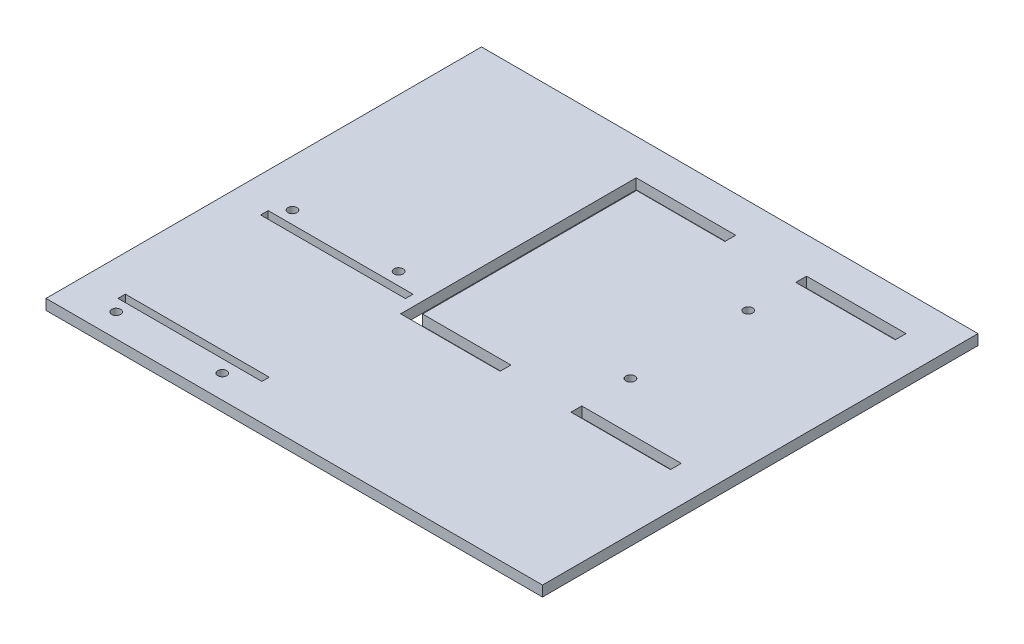
ISO-10303-21;
HEADER;
FILE_DESCRIPTION(('STEP AP214'),'2;1');
FILE_NAME('part.step','',(''),(''),'','','');
FILE_SCHEMA(('AUTOMOTIVE_DESIGN { 1 0 10303 214 1 1 1 1 }'));
ENDSEC;
DATA;
#1=APPLICATION_CONTEXT('core data for automotive mechanical design processes');
#2=APPLICATION_PROTOCOL_DEFINITION('international standard','automotive_design',2000,#1);
#3=PRODUCT_CONTEXT('',#1,'mechanical');
#4=PRODUCT('Part','Part','',(#3));
#5=PRODUCT_RELATED_PRODUCT_CATEGORY('part','',(#4));
#6=PRODUCT_DEFINITION_FORMATION('','',#4);
#7=PRODUCT_DEFINITION_CONTEXT('part definition',#1,'design');
#8=PRODUCT_DEFINITION('design','',#6,#7);
#9=PRODUCT_DEFINITION_SHAPE('','',#8);
#10=(LENGTH_UNIT() NAMED_UNIT(*) SI_UNIT(.MILLI.,.METRE.));
#11=(NAMED_UNIT(*) PLANE_ANGLE_UNIT() SI_UNIT($,.RADIAN.));
#12=(NAMED_UNIT(*) SI_UNIT($,.STERADIAN.) SOLID_ANGLE_UNIT());
#13=UNCERTAINTY_MEASURE_WITH_UNIT(LENGTH_MEASURE(1.E-05),#10,'distance_accuracy_value','');
#14=(GEOMETRIC_REPRESENTATION_CONTEXT(3) GLOBAL_UNCERTAINTY_ASSIGNED_CONTEXT((#13)) GLOBAL_UNIT_ASSIGNED_CONTEXT((#10,
#11,#12)) REPRESENTATION_CONTEXT('',''));
#15=CARTESIAN_POINT('',(0.,0.,0.));
#16=DIRECTION('',(0.,0.,1.));
#17=DIRECTION('',(1.,0.,0.));
#18=AXIS2_PLACEMENT_3D('',#15,#16,#17);
#19=CARTESIAN_POINT('',(0.,186.463763673541,143.058377348707));
#20=DIRECTION('',(0.,0.,-1.));
#21=DIRECTION('',(-1.,0.,0.));
#22=AXIS2_PLACEMENT_3D('',#19,#20,#21);
#23=PLANE('',#22);
#24=DIRECTION('',(0.,-1.,0.));
#25=VECTOR('',#24,1.);
#26=CARTESIAN_POINT('',(-40.25,186.463763673541,143.058377348707));
#27=LINE('',#26,#25);
#28=CARTESIAN_POINT('',(-40.25,2.90000000000001,143.058377348707));
#29=VERTEX_POINT('',#28);
#30=CARTESIAN_POINT('',(-40.25,0.,143.058377348707));
#31=VERTEX_POINT('',#30);
#32=EDGE_CURVE('E303',#29,#31,#27,.T.);
#33=ORIENTED_EDGE('',*,*,#32,.F.);
#34=DIRECTION('',(1.,0.,0.));
#35=VECTOR('',#34,1.);
#36=CARTESIAN_POINT('',(0.,2.90000000000001,143.058377348707));
#37=LINE('',#36,#35);
#38=CARTESIAN_POINT('',(0.,2.90000000000001,143.058377348707));
#39=VERTEX_POINT('',#38);
#40=EDGE_CURVE('E539',#29,#39,#37,.T.);
#41=ORIENTED_EDGE('',*,*,#40,.T.);
#42=DIRECTION('',(0.,-1.,0.));
#43=VECTOR('',#42,1.);
#44=CARTESIAN_POINT('',(0.,186.463763673541,143.058377348707));
#45=LINE('',#44,#43);
#46=CARTESIAN_POINT('',(0.,0.,143.058377348707));
#47=VERTEX_POINT('',#46);
#48=EDGE_CURVE('E301',#39,#47,#45,.T.);
#49=ORIENTED_EDGE('',*,*,#48,.T.);
#50=DIRECTION('',(1.,0.,0.));
#51=VECTOR('',#50,1.);
#52=CARTESIAN_POINT('',(0.,0.,143.058377348707));
#53=LINE('',#52,#51);
#54=EDGE_CURVE('E298',#31,#47,#53,.T.);
#55=ORIENTED_EDGE('',*,*,#54,.F.);
#56=EDGE_LOOP('',(#33,#41,#49,#55));
#57=FACE_BOUND('',#56,.T.);
#58=ADVANCED_FACE('F36',(#57),#23,.T.);
#59=CARTESIAN_POINT('',(-40.25,186.463763673541,140.958377348707));
#60=DIRECTION('',(1.,0.,0.));
#61=DIRECTION('',(0.,0.,-1.));
#62=AXIS2_PLACEMENT_3D('',#59,#60,#61);
#63=PLANE('',#62);
#64=DIRECTION('',(0.,-1.,0.));
#65=VECTOR('',#64,1.);
#66=CARTESIAN_POINT('',(-40.25,186.463763673541,140.958377348707));
#67=LINE('',#66,#65);
#68=CARTESIAN_POINT('',(-40.25,2.90000000000001,140.958377348707));
#69=VERTEX_POINT('',#68);
#70=CARTESIAN_POINT('',(-40.25,0.,140.958377348707));
#71=VERTEX_POINT('',#70);
#72=EDGE_CURVE('E305',#69,#71,#67,.T.);
#73=ORIENTED_EDGE('',*,*,#72,.F.);
#74=DIRECTION('',(0.,0.,1.));
#75=VECTOR('',#74,1.);
#76=CARTESIAN_POINT('',(-40.25,2.90000000000001,140.958377348707));
#77=LINE('',#76,#75);
#78=EDGE_CURVE('E542',#69,#29,#77,.T.);
#79=ORIENTED_EDGE('',*,*,#78,.T.);
#80=ORIENTED_EDGE('',*,*,#32,.T.);
#81=DIRECTION('',(0.,0.,1.));
#82=VECTOR('',#81,1.);
#83=CARTESIAN_POINT('',(-40.25,0.,140.958377348707));
#84=LINE('',#83,#82);
#85=EDGE_CURVE('E295',#71,#31,#84,.T.);
#86=ORIENTED_EDGE('',*,*,#85,.F.);
#87=EDGE_LOOP('',(#73,#79,#80,#86));
#88=FACE_BOUND('',#87,.T.);
#89=ADVANCED_FACE('F458',(#88),#63,.T.);
#90=CARTESIAN_POINT('',(0.,186.463763673541,140.958377348707));
#91=DIRECTION('',(0.,0.,1.));
#92=DIRECTION('',(1.,0.,0.));
#93=AXIS2_PLACEMENT_3D('',#90,#91,#92);
#94=PLANE('',#93);
#95=DIRECTION('',(0.,-1.,0.));
#96=VECTOR('',#95,1.);
#97=CARTESIAN_POINT('',(0.,186.463763673541,140.958377348707));
#98=LINE('',#97,#96);
#99=CARTESIAN_POINT('',(0.,2.90000000000001,140.958377348707));
#100=VERTEX_POINT('',#99);
#101=CARTESIAN_POINT('',(0.,0.,140.958377348707));
#102=VERTEX_POINT('',#101);
#103=EDGE_CURVE('E307',#100,#102,#98,.T.);
#104=ORIENTED_EDGE('',*,*,#103,.F.);
#105=DIRECTION('',(-1.,0.,0.));
#106=VECTOR('',#105,1.);
#107=CARTESIAN_POINT('',(0.,2.90000000000001,140.958377348707));
#108=LINE('',#107,#106);
#109=EDGE_CURVE('E548',#100,#69,#108,.T.);
#110=ORIENTED_EDGE('',*,*,#109,.T.);
#111=ORIENTED_EDGE('',*,*,#72,.T.);
#112=DIRECTION('',(-1.,0.,0.));
#113=VECTOR('',#112,1.);
#114=CARTESIAN_POINT('',(0.,0.,140.958377348707));
#115=LINE('',#114,#113);
#116=EDGE_CURVE('E291',#102,#71,#115,.T.);
#117=ORIENTED_EDGE('',*,*,#116,.F.);
#118=EDGE_LOOP('',(#104,#110,#111,#117));
#119=FACE_BOUND('',#118,.T.);
#120=ADVANCED_FACE('F464',(#119),#94,.T.);
#121=CARTESIAN_POINT('',(0.,186.463763673541,140.958377348707));
#122=DIRECTION('',(-1.,0.,0.));
#123=DIRECTION('',(0.,0.,1.));
#124=AXIS2_PLACEMENT_3D('',#121,#122,#123);
#125=PLANE('',#124);
#126=ORIENTED_EDGE('',*,*,#48,.F.);
#127=DIRECTION('',(0.,0.,-1.));
#128=VECTOR('',#127,1.);
#129=CARTESIAN_POINT('',(0.,2.90000000000001,140.958377348707));
#130=LINE('',#129,#128);
#131=EDGE_CURVE('E551',#39,#100,#130,.T.);
#132=ORIENTED_EDGE('',*,*,#131,.T.);
#133=ORIENTED_EDGE('',*,*,#103,.T.);
#134=DIRECTION('',(0.,0.,-1.));
#135=VECTOR('',#134,1.);
#136=CARTESIAN_POINT('',(0.,0.,140.958377348707));
#137=LINE('',#136,#135);
#138=EDGE_CURVE('E288',#47,#102,#137,.T.);
#139=ORIENTED_EDGE('',*,*,#138,.F.);
#140=EDGE_LOOP('',(#126,#132,#133,#139));
#141=FACE_BOUND('',#140,.T.);
#142=ADVANCED_FACE('F474',(#141),#125,.T.);
#143=CARTESIAN_POINT('',(77.9999999999991,186.463763673541,147.390770958943));
#144=DIRECTION('',(0.,0.,-1.));
#145=DIRECTION('',(-1.,0.,0.));
#146=AXIS2_PLACEMENT_3D('',#143,#144,#145);
#147=PLANE('',#146);
#148=DIRECTION('',(0.,-1.,0.));
#149=VECTOR('',#148,1.);
#150=CARTESIAN_POINT('',(50.3499999999991,186.463763673541,147.390770958943));
#151=LINE('',#150,#149);
#152=CARTESIAN_POINT('',(50.3499999999991,2.90000000000001,147.390770958943));
#153=VERTEX_POINT('',#152);
#154=CARTESIAN_POINT('',(50.3499999999991,0.,147.390770958943));
#155=VERTEX_POINT('',#154);
#156=EDGE_CURVE('E321',#153,#155,#151,.T.);
#157=ORIENTED_EDGE('',*,*,#156,.F.);
#158=DIRECTION('',(1.,0.,0.));
#159=VECTOR('',#158,1.);
#160=CARTESIAN_POINT('',(77.9999999999991,2.90000000000001,147.390770958943));
#161=LINE('',#160,#159);
#162=CARTESIAN_POINT('',(77.9999999999991,2.90000000000001,147.390770958943));
#163=VERTEX_POINT('',#162);
#164=EDGE_CURVE('E403',#153,#163,#161,.T.);
#165=ORIENTED_EDGE('',*,*,#164,.T.);
#166=DIRECTION('',(0.,-1.,0.));
#167=VECTOR('',#166,1.);
#168=CARTESIAN_POINT('',(77.9999999999991,186.463763673541,147.390770958943));
#169=LINE('',#168,#167);
#170=CARTESIAN_POINT('',(77.9999999999991,0.,147.390770958943));
#171=VERTEX_POINT('',#170);
#172=EDGE_CURVE('E319',#163,#171,#169,.T.);
#173=ORIENTED_EDGE('',*,*,#172,.T.);
#174=DIRECTION('',(1.,0.,0.));
#175=VECTOR('',#174,1.);
#176=CARTESIAN_POINT('',(77.9999999999991,0.,147.390770958943));
#177=LINE('',#176,#175);
#178=EDGE_CURVE('E316',#155,#171,#177,.T.);
#179=ORIENTED_EDGE('',*,*,#178,.F.);
#180=EDGE_LOOP('',(#157,#165,#173,#179));
#181=FACE_BOUND('',#180,.T.);
#182=ADVANCED_FACE('F478',(#181),#147,.T.);
#183=CARTESIAN_POINT('',(50.3499999999991,186.463763673541,144.390770958943));
#184=DIRECTION('',(1.,0.,0.));
#185=DIRECTION('',(0.,0.,-1.));
#186=AXIS2_PLACEMENT_3D('',#183,#184,#185);
#187=PLANE('',#186);
#188=DIRECTION('',(0.,-1.,0.));
#189=VECTOR('',#188,1.);
#190=CARTESIAN_POINT('',(50.3499999999991,186.463763673541,144.390770958943));
#191=LINE('',#190,#189);
#192=CARTESIAN_POINT('',(50.3499999999991,2.90000000000001,144.390770958943));
#193=VERTEX_POINT('',#192);
#194=CARTESIAN_POINT('',(50.3499999999991,0.,144.390770958943));
#195=VERTEX_POINT('',#194);
#196=EDGE_CURVE('E324',#193,#195,#191,.T.);
#197=ORIENTED_EDGE('',*,*,#196,.F.);
#198=DIRECTION('',(0.,0.,1.));
#199=VECTOR('',#198,1.);
#200=CARTESIAN_POINT('',(50.3499999999991,2.90000000000001,144.390770958943));
#201=LINE('',#200,#199);
#202=EDGE_CURVE('E400',#193,#153,#201,.T.);
#203=ORIENTED_EDGE('',*,*,#202,.T.);
#204=ORIENTED_EDGE('',*,*,#156,.T.);
#205=DIRECTION('',(0.,0.,1.));
#206=VECTOR('',#205,1.);
#207=CARTESIAN_POINT('',(50.3499999999991,0.,0.));
#208=LINE('',#207,#206);
#209=EDGE_CURVE('E315',#195,#155,#208,.T.);
#210=ORIENTED_EDGE('',*,*,#209,.F.);
#211=EDGE_LOOP('',(#197,#203,#204,#210));
#212=FACE_BOUND('',#211,.T.);
#213=ADVANCED_FACE('F38',(#212),#187,.T.);
#214=CARTESIAN_POINT('',(77.9999999999991,186.463763673541,144.390770958943));
#215=DIRECTION('',(0.,0.,1.));
#216=DIRECTION('',(1.,0.,0.));
#217=AXIS2_PLACEMENT_3D('',#214,#215,#216);
#218=PLANE('',#217);
#219=DIRECTION('',(0.,-1.,0.));
#220=VECTOR('',#219,1.);
#221=CARTESIAN_POINT('',(77.9999999999991,186.463763673541,144.390770958943));
#222=LINE('',#221,#220);
#223=CARTESIAN_POINT('',(77.9999999999991,2.90000000000001,144.390770958943));
#224=VERTEX_POINT('',#223);
#225=CARTESIAN_POINT('',(77.9999999999991,0.,144.390770958943));
#226=VERTEX_POINT('',#225);
#227=EDGE_CURVE('E322',#224,#226,#222,.T.);
#228=ORIENTED_EDGE('',*,*,#227,.F.);
#229=DIRECTION('',(-1.,0.,0.));
#230=VECTOR('',#229,1.);
#231=CARTESIAN_POINT('',(77.9999999999991,2.90000000000001,144.390770958943));
#232=LINE('',#231,#230);
#233=EDGE_CURVE('E241',#224,#193,#232,.T.);
#234=ORIENTED_EDGE('',*,*,#233,.T.);
#235=ORIENTED_EDGE('',*,*,#196,.T.);
#236=DIRECTION('',(-1.,0.,0.));
#237=VECTOR('',#236,1.);
#238=CARTESIAN_POINT('',(77.9999999999991,0.,144.390770958943));
#239=LINE('',#238,#237);
#240=EDGE_CURVE('E312',#226,#195,#239,.T.);
#241=ORIENTED_EDGE('',*,*,#240,.F.);
#242=EDGE_LOOP('',(#228,#234,#235,#241));
#243=FACE_BOUND('',#242,.T.);
#244=ADVANCED_FACE('F483',(#243),#218,.T.);
#245=CARTESIAN_POINT('',(77.9999999999991,186.463763673541,147.390770958943));
#246=DIRECTION('',(-1.,0.,0.));
#247=DIRECTION('',(0.,0.,1.));
#248=AXIS2_PLACEMENT_3D('',#245,#246,#247);
#249=PLANE('',#248);
#250=ORIENTED_EDGE('',*,*,#172,.F.);
#251=DIRECTION('',(0.,0.,-1.));
#252=VECTOR('',#251,1.);
#253=CARTESIAN_POINT('',(77.9999999999991,2.90000000000001,147.390770958943));
#254=LINE('',#253,#252);
#255=EDGE_CURVE('E237',#163,#224,#254,.T.);
#256=ORIENTED_EDGE('',*,*,#255,.T.);
#257=ORIENTED_EDGE('',*,*,#227,.T.);
#258=DIRECTION('',(0.,0.,-1.));
#259=VECTOR('',#258,1.);
#260=CARTESIAN_POINT('',(77.9999999999991,0.,147.390770958943));
#261=LINE('',#260,#259);
#262=EDGE_CURVE('E309',#171,#226,#261,.T.);
#263=ORIENTED_EDGE('',*,*,#262,.F.);
#264=EDGE_LOOP('',(#250,#256,#257,#263));
#265=FACE_BOUND('',#264,.T.);
#266=ADVANCED_FACE('F486',(#265),#249,.T.);
#267=CARTESIAN_POINT('',(-40.0000000000001,186.463763673541,180.908377348707));
#268=DIRECTION('',(0.,0.,1.));
#269=DIRECTION('',(1.,0.,0.));
#270=AXIS2_PLACEMENT_3D('',#267,#268,#269);
#271=PLANE('',#270);
#272=DIRECTION('',(0.,-1.,0.));
#273=VECTOR('',#272,1.);
#274=CARTESIAN_POINT('',(0.,186.463763673541,180.908377348707));
#275=LINE('',#274,#273);
#276=CARTESIAN_POINT('',(0.,2.90000000000001,180.908377348707));
#277=VERTEX_POINT('',#276);
#278=CARTESIAN_POINT('',(0.,0.,180.908377348707));
#279=VERTEX_POINT('',#278);
#280=EDGE_CURVE('E231',#277,#279,#275,.T.);
#281=ORIENTED_EDGE('',*,*,#280,.F.);
#282=DIRECTION('',(-1.,0.,0.));
#283=VECTOR('',#282,1.);
#284=CARTESIAN_POINT('',(-40.0000000000001,2.90000000000001,180.908377348707));
#285=LINE('',#284,#283);
#286=CARTESIAN_POINT('',(-40.0000000000001,2.90000000000001,180.908377348707));
#287=VERTEX_POINT('',#286);
#288=EDGE_CURVE('E216',#277,#287,#285,.T.);
#289=ORIENTED_EDGE('',*,*,#288,.T.);
#290=DIRECTION('',(0.,-1.,0.));
#291=VECTOR('',#290,1.);
#292=CARTESIAN_POINT('',(-40.0000000000001,186.463763673541,180.908377348707));
#293=LINE('',#292,#291);
#294=CARTESIAN_POINT('',(-40.0000000000001,0.,180.908377348707));
#295=VERTEX_POINT('',#294);
#296=EDGE_CURVE('E224',#287,#295,#293,.T.);
#297=ORIENTED_EDGE('',*,*,#296,.T.);
#298=DIRECTION('',(-1.,0.,0.));
#299=VECTOR('',#298,1.);
#300=CARTESIAN_POINT('',(-40.0000000000001,0.,180.908377348707));
#301=LINE('',#300,#299);
#302=EDGE_CURVE('E232',#279,#295,#301,.T.);
#303=ORIENTED_EDGE('',*,*,#302,.F.);
#304=EDGE_LOOP('',(#281,#289,#297,#303));
#305=FACE_BOUND('',#304,.T.);
#306=ADVANCED_FACE('F235',(#305),#271,.T.);
#307=CARTESIAN_POINT('',(0.,186.463763673541,182.958377348707));
#308=DIRECTION('',(-1.,0.,0.));
#309=DIRECTION('',(0.,0.,1.));
#310=AXIS2_PLACEMENT_3D('',#307,#308,#309);
#311=PLANE('',#310);
#312=DIRECTION('',(0.,-1.,0.));
#313=VECTOR('',#312,1.);
#314=CARTESIAN_POINT('',(0.,186.463763673541,182.958377348707));
#315=LINE('',#314,#313);
#316=CARTESIAN_POINT('',(0.,2.90000000000001,182.958377348707));
#317=VERTEX_POINT('',#316);
#318=CARTESIAN_POINT('',(0.,0.,182.958377348707));
#319=VERTEX_POINT('',#318);
#320=EDGE_CURVE('E334',#317,#319,#315,.T.);
#321=ORIENTED_EDGE('',*,*,#320,.F.);
#322=DIRECTION('',(0.,0.,-1.));
#323=VECTOR('',#322,1.);
#324=CARTESIAN_POINT('',(0.,2.90000000000001,182.958377348707));
#325=LINE('',#324,#323);
#326=EDGE_CURVE('E236',#317,#277,#325,.T.);
#327=ORIENTED_EDGE('',*,*,#326,.T.);
#328=ORIENTED_EDGE('',*,*,#280,.T.);
#329=DIRECTION('',(0.,0.,-1.));
#330=VECTOR('',#329,1.);
#331=CARTESIAN_POINT('',(0.,0.,182.958377348707));
#332=LINE('',#331,#330);
#333=EDGE_CURVE('E329',#319,#279,#332,.T.);
#334=ORIENTED_EDGE('',*,*,#333,.F.);
#335=EDGE_LOOP('',(#321,#327,#328,#334));
#336=FACE_BOUND('',#335,.T.);
#337=ADVANCED_FACE('F493',(#336),#311,.T.);
#338=CARTESIAN_POINT('',(-40.,186.463763673541,182.958377348707));
#339=DIRECTION('',(0.,0.,-1.));
#340=DIRECTION('',(-1.,0.,0.));
#341=AXIS2_PLACEMENT_3D('',#338,#339,#340);
#342=PLANE('',#341);
#343=DIRECTION('',(0.,-1.,0.));
#344=VECTOR('',#343,1.);
#345=CARTESIAN_POINT('',(-40.,186.463763673541,182.958377348707));
#346=LINE('',#345,#344);
#347=CARTESIAN_POINT('',(-40.,2.90000000000001,182.958377348707));
#348=VERTEX_POINT('',#347);
#349=CARTESIAN_POINT('',(-40.,0.,182.958377348707));
#350=VERTEX_POINT('',#349);
#351=EDGE_CURVE('E336',#348,#350,#346,.T.);
#352=ORIENTED_EDGE('',*,*,#351,.F.);
#353=DIRECTION('',(1.,0.,0.));
#354=VECTOR('',#353,1.);
#355=CARTESIAN_POINT('',(-40.,2.90000000000001,182.958377348707));
#356=LINE('',#355,#354);
#357=EDGE_CURVE('E219',#348,#317,#356,.T.);
#358=ORIENTED_EDGE('',*,*,#357,.T.);
#359=ORIENTED_EDGE('',*,*,#320,.T.);
#360=DIRECTION('',(1.,0.,0.));
#361=VECTOR('',#360,1.);
#362=CARTESIAN_POINT('',(-40.,0.,182.958377348707));
#363=LINE('',#362,#361);
#364=EDGE_CURVE('E326',#350,#319,#363,.T.);
#365=ORIENTED_EDGE('',*,*,#364,.F.);
#366=EDGE_LOOP('',(#352,#358,#359,#365));
#367=FACE_BOUND('',#366,.T.);
#368=ADVANCED_FACE('F455',(#367),#342,.T.);
#369=CARTESIAN_POINT('',(-40.,186.463763673541,182.958377348707));
#370=DIRECTION('',(1.,0.,0.));
#371=DIRECTION('',(0.,0.,-1.));
#372=AXIS2_PLACEMENT_3D('',#369,#370,#371);
#373=PLANE('',#372);
#374=ORIENTED_EDGE('',*,*,#296,.F.);
#375=DIRECTION('',(0.,0.,1.));
#376=VECTOR('',#375,1.);
#377=CARTESIAN_POINT('',(-40.,2.90000000000001,182.958377348707));
#378=LINE('',#377,#376);
#379=EDGE_CURVE('E210',#287,#348,#378,.T.);
#380=ORIENTED_EDGE('',*,*,#379,.T.);
#381=ORIENTED_EDGE('',*,*,#351,.T.);
#382=DIRECTION('',(0.,0.,1.));
#383=VECTOR('',#382,1.);
#384=CARTESIAN_POINT('',(-40.,0.,182.958377348707));
#385=LINE('',#384,#383);
#386=EDGE_CURVE('E227',#295,#350,#385,.T.);
#387=ORIENTED_EDGE('',*,*,#386,.F.);
#388=EDGE_LOOP('',(#374,#380,#381,#387));
#389=FACE_BOUND('',#388,.T.);
#390=ADVANCED_FACE('F225',(#389),#373,.T.);
#391=CARTESIAN_POINT('',(2.99999999999988,186.463763673541,81.9143550510485));
#392=DIRECTION('',(1.,0.,0.));
#393=DIRECTION('',(0.,0.,-1.));
#394=AXIS2_PLACEMENT_3D('',#391,#392,#393);
#395=PLANE('',#394);
#396=DIRECTION('',(0.,-1.,0.));
#397=VECTOR('',#396,1.);
#398=CARTESIAN_POINT('',(2.99999999999988,186.463763673541,81.9143550510485));
#399=LINE('',#398,#397);
#400=CARTESIAN_POINT('',(2.99999999999988,2.90000000000001,81.9143550510485));
#401=VERTEX_POINT('',#400);
#402=CARTESIAN_POINT('',(2.99999999999988,0.,81.9143550510485));
#403=VERTEX_POINT('',#402);
#404=EDGE_CURVE('E360',#401,#403,#399,.T.);
#405=ORIENTED_EDGE('',*,*,#404,.F.);
#406=DIRECTION('',(0.,0.,1.));
#407=VECTOR('',#406,1.);
#408=CARTESIAN_POINT('',(2.99999999999988,2.90000000000001,81.9143550510485));
#409=LINE('',#408,#407);
#410=CARTESIAN_POINT('',(2.99999999999988,2.90000000000001,147.390770958943));
#411=VERTEX_POINT('',#410);
#412=EDGE_CURVE('E129',#401,#411,#409,.T.);
#413=ORIENTED_EDGE('',*,*,#412,.T.);
#414=DIRECTION('',(0.,-1.,0.));
#415=VECTOR('',#414,1.);
#416=CARTESIAN_POINT('',(2.99999999999988,186.463763673541,147.390770958943));
#417=LINE('',#416,#415);
#418=CARTESIAN_POINT('',(2.99999999999988,0.,147.390770958943));
#419=VERTEX_POINT('',#418);
#420=EDGE_CURVE('E358',#411,#419,#417,.T.);
#421=ORIENTED_EDGE('',*,*,#420,.T.);
#422=DIRECTION('',(0.,0.,1.));
#423=VECTOR('',#422,1.);
#424=CARTESIAN_POINT('',(2.99999999999988,0.,81.9143550510485));
#425=LINE('',#424,#423);
#426=EDGE_CURVE('E355',#403,#419,#425,.T.);
#427=ORIENTED_EDGE('',*,*,#426,.F.);
#428=EDGE_LOOP('',(#405,#413,#421,#427));
#429=FACE_BOUND('',#428,.T.);
#430=ADVANCED_FACE('F447',(#429),#395,.T.);
#431=CARTESIAN_POINT('',(2.99999999999988,186.463763673541,81.9143550510485));
#432=DIRECTION('',(0.,0.,1.));
#433=DIRECTION('',(1.,0.,0.));
#434=AXIS2_PLACEMENT_3D('',#431,#432,#433);
#435=PLANE('',#434);
#436=DIRECTION('',(0.,-1.,0.));
#437=VECTOR('',#436,1.);
#438=CARTESIAN_POINT('',(30.6499999999991,186.463763673541,81.9143550510485));
#439=LINE('',#438,#437);
#440=CARTESIAN_POINT('',(30.6499999999991,2.90000000000001,81.9143550510485));
#441=VERTEX_POINT('',#440);
#442=CARTESIAN_POINT('',(30.6499999999991,0.,81.9143550510485));
#443=VERTEX_POINT('',#442);
#444=EDGE_CURVE('E362',#441,#443,#439,.T.);
#445=ORIENTED_EDGE('',*,*,#444,.F.);
#446=DIRECTION('',(-1.,0.,0.));
#447=VECTOR('',#446,1.);
#448=CARTESIAN_POINT('',(2.99999999999988,2.90000000000001,81.9143550510485));
#449=LINE('',#448,#447);
#450=EDGE_CURVE('E123',#441,#401,#449,.T.);
#451=ORIENTED_EDGE('',*,*,#450,.T.);
#452=ORIENTED_EDGE('',*,*,#404,.T.);
#453=DIRECTION('',(-1.,0.,0.));
#454=VECTOR('',#453,1.);
#455=CARTESIAN_POINT('',(2.99999999999988,0.,81.9143550510485));
#456=LINE('',#455,#454);
#457=EDGE_CURVE('E352',#443,#403,#456,.T.);
#458=ORIENTED_EDGE('',*,*,#457,.F.);
#459=EDGE_LOOP('',(#445,#451,#452,#458));
#460=FACE_BOUND('',#459,.T.);
#461=ADVANCED_FACE('F419',(#460),#435,.T.);
#462=CARTESIAN_POINT('',(30.6499999999991,186.463763673541,81.9143550510485));
#463=DIRECTION('',(-1.,0.,0.));
#464=DIRECTION('',(0.,0.,1.));
#465=AXIS2_PLACEMENT_3D('',#462,#463,#464);
#466=PLANE('',#465);
#467=DIRECTION('',(0.,-1.,0.));
#468=VECTOR('',#467,1.);
#469=CARTESIAN_POINT('',(30.6499999999991,186.463763673541,84.9143550510485));
#470=LINE('',#469,#468);
#471=CARTESIAN_POINT('',(30.6499999999991,2.90000000000001,84.9143550510485));
#472=VERTEX_POINT('',#471);
#473=CARTESIAN_POINT('',(30.6499999999991,0.,84.9143550510485));
#474=VERTEX_POINT('',#473);
#475=EDGE_CURVE('E366',#472,#474,#470,.T.);
#476=ORIENTED_EDGE('',*,*,#475,.F.);
#477=DIRECTION('',(0.,0.,-1.));
#478=VECTOR('',#477,1.);
#479=CARTESIAN_POINT('',(30.6499999999991,2.90000000000001,81.9143550510485));
#480=LINE('',#479,#478);
#481=EDGE_CURVE('E40',#472,#441,#480,.T.);
#482=ORIENTED_EDGE('',*,*,#481,.T.);
#483=ORIENTED_EDGE('',*,*,#444,.T.);
#484=DIRECTION('',(0.,0.,-1.));
#485=VECTOR('',#484,1.);
#486=CARTESIAN_POINT('',(30.6499999999991,0.,0.));
#487=LINE('',#486,#485);
#488=EDGE_CURVE('E351',#474,#443,#487,.T.);
#489=ORIENTED_EDGE('',*,*,#488,.F.);
#490=EDGE_LOOP('',(#476,#482,#483,#489));
#491=FACE_BOUND('',#490,.T.);
#492=ADVANCED_FACE('F417',(#491),#466,.T.);
#493=CARTESIAN_POINT('',(6.09999999999987,186.463763673541,84.9143550510485));
#494=DIRECTION('',(0.,0.,-1.));
#495=DIRECTION('',(-1.,0.,0.));
#496=AXIS2_PLACEMENT_3D('',#493,#494,#495);
#497=PLANE('',#496);
#498=DIRECTION('',(0.,-1.,0.));
#499=VECTOR('',#498,1.);
#500=CARTESIAN_POINT('',(6.09999999999987,186.463763673541,84.9143550510485));
#501=LINE('',#500,#499);
#502=CARTESIAN_POINT('',(6.09999999999987,2.90000000000001,84.9143550510485));
#503=VERTEX_POINT('',#502);
#504=CARTESIAN_POINT('',(6.09999999999987,0.,84.9143550510485));
#505=VERTEX_POINT('',#504);
#506=EDGE_CURVE('E363',#503,#505,#501,.T.);
#507=ORIENTED_EDGE('',*,*,#506,.F.);
#508=DIRECTION('',(1.,0.,0.));
#509=VECTOR('',#508,1.);
#510=CARTESIAN_POINT('',(6.09999999999987,2.90000000000001,84.9143550510485));
#511=LINE('',#510,#509);
#512=EDGE_CURVE('E248',#503,#472,#511,.T.);
#513=ORIENTED_EDGE('',*,*,#512,.T.);
#514=ORIENTED_EDGE('',*,*,#475,.T.);
#515=DIRECTION('',(1.,0.,0.));
#516=VECTOR('',#515,1.);
#517=CARTESIAN_POINT('',(6.09999999999987,0.,84.9143550510485));
#518=LINE('',#517,#516);
#519=EDGE_CURVE('E348',#505,#474,#518,.T.);
#520=ORIENTED_EDGE('',*,*,#519,.F.);
#521=EDGE_LOOP('',(#507,#513,#514,#520));
#522=FACE_BOUND('',#521,.T.);
#523=ADVANCED_FACE('F429',(#522),#497,.T.);
#524=CARTESIAN_POINT('',(6.09999999999988,186.463763673541,144.390770958943));
#525=DIRECTION('',(-1.,0.,0.));
#526=DIRECTION('',(0.,0.,1.));
#527=AXIS2_PLACEMENT_3D('',#524,#525,#526);
#528=PLANE('',#527);
#529=DIRECTION('',(0.,-1.,0.));
#530=VECTOR('',#529,1.);
#531=CARTESIAN_POINT('',(6.09999999999988,186.463763673541,144.390770958943));
#532=LINE('',#531,#530);
#533=CARTESIAN_POINT('',(6.09999999999988,2.90000000000001,144.390770958943));
#534=VERTEX_POINT('',#533);
#535=CARTESIAN_POINT('',(6.09999999999988,0.,144.390770958943));
#536=VERTEX_POINT('',#535);
#537=EDGE_CURVE('E365',#534,#536,#532,.T.);
#538=ORIENTED_EDGE('',*,*,#537,.F.);
#539=DIRECTION('',(0.,0.,-1.));
#540=VECTOR('',#539,1.);
#541=CARTESIAN_POINT('',(6.09999999999988,2.90000000000001,144.390770958943));
#542=LINE('',#541,#540);
#543=EDGE_CURVE('E251',#534,#503,#542,.T.);
#544=ORIENTED_EDGE('',*,*,#543,.T.);
#545=ORIENTED_EDGE('',*,*,#506,.T.);
#546=DIRECTION('',(0.,0.,-1.));
#547=VECTOR('',#546,1.);
#548=CARTESIAN_POINT('',(6.09999999999988,0.,144.390770958943));
#549=LINE('',#548,#547);
#550=EDGE_CURVE('E345',#536,#505,#549,.T.);
#551=ORIENTED_EDGE('',*,*,#550,.F.);
#552=EDGE_LOOP('',(#538,#544,#545,#551));
#553=FACE_BOUND('',#552,.T.);
#554=ADVANCED_FACE('F434',(#553),#528,.T.);
#555=CARTESIAN_POINT('',(30.4999999999991,186.463763673541,144.390770958943));
#556=DIRECTION('',(0.,0.,1.));
#557=DIRECTION('',(1.,0.,0.));
#558=AXIS2_PLACEMENT_3D('',#555,#556,#557);
#559=PLANE('',#558);
#560=DIRECTION('',(0.,-1.,0.));
#561=VECTOR('',#560,1.);
#562=CARTESIAN_POINT('',(30.6499999999991,186.463763673541,144.390770958943));
#563=LINE('',#562,#561);
#564=CARTESIAN_POINT('',(30.6499999999991,2.90000000000001,144.390770958943));
#565=VERTEX_POINT('',#564);
#566=CARTESIAN_POINT('',(30.6499999999991,0.,144.390770958943));
#567=VERTEX_POINT('',#566);
#568=EDGE_CURVE('E368',#565,#567,#563,.T.);
#569=ORIENTED_EDGE('',*,*,#568,.F.);
#570=DIRECTION('',(-1.,0.,0.));
#571=VECTOR('',#570,1.);
#572=CARTESIAN_POINT('',(30.4999999999991,2.90000000000001,144.390770958943));
#573=LINE('',#572,#571);
#574=EDGE_CURVE('E254',#565,#534,#573,.T.);
#575=ORIENTED_EDGE('',*,*,#574,.T.);
#576=ORIENTED_EDGE('',*,*,#537,.T.);
#577=DIRECTION('',(-1.,0.,0.));
#578=VECTOR('',#577,1.);
#579=CARTESIAN_POINT('',(30.4999999999991,0.,144.390770958943));
#580=LINE('',#579,#578);
#581=EDGE_CURVE('E342',#567,#536,#580,.T.);
#582=ORIENTED_EDGE('',*,*,#581,.F.);
#583=EDGE_LOOP('',(#569,#575,#576,#582));
#584=FACE_BOUND('',#583,.T.);
#585=ADVANCED_FACE('F437',(#584),#559,.T.);
#586=CARTESIAN_POINT('',(30.6499999999991,186.463763673541,147.390770958943));
#587=DIRECTION('',(-1.,0.,0.));
#588=DIRECTION('',(0.,0.,1.));
#589=AXIS2_PLACEMENT_3D('',#586,#587,#588);
#590=PLANE('',#589);
#591=DIRECTION('',(0.,-1.,0.));
#592=VECTOR('',#591,1.);
#593=CARTESIAN_POINT('',(30.6499999999991,186.463763673541,147.390770958943));
#594=LINE('',#593,#592);
#595=CARTESIAN_POINT('',(30.6499999999991,2.90000000000001,147.390770958943));
#596=VERTEX_POINT('',#595);
#597=CARTESIAN_POINT('',(30.6499999999991,0.,147.390770958943));
#598=VERTEX_POINT('',#597);
#599=EDGE_CURVE('E373',#596,#598,#594,.T.);
#600=ORIENTED_EDGE('',*,*,#599,.F.);
#601=DIRECTION('',(0.,0.,-1.));
#602=VECTOR('',#601,1.);
#603=CARTESIAN_POINT('',(30.6499999999991,2.90000000000001,147.390770958943));
#604=LINE('',#603,#602);
#605=EDGE_CURVE('E257',#596,#565,#604,.T.);
#606=ORIENTED_EDGE('',*,*,#605,.T.);
#607=ORIENTED_EDGE('',*,*,#568,.T.);
#608=DIRECTION('',(0.,0.,-1.));
#609=VECTOR('',#608,1.);
#610=CARTESIAN_POINT('',(30.649999999999,0.,0.));
#611=LINE('',#610,#609);
#612=EDGE_CURVE('E341',#598,#567,#611,.T.);
#613=ORIENTED_EDGE('',*,*,#612,.F.);
#614=EDGE_LOOP('',(#600,#606,#607,#613));
#615=FACE_BOUND('',#614,.T.);
#616=ADVANCED_FACE('F441',(#615),#590,.T.);
#617=CARTESIAN_POINT('',(30.4999999999991,186.463763673541,147.390770958943));
#618=DIRECTION('',(0.,0.,-1.));
#619=DIRECTION('',(-1.,0.,0.));
#620=AXIS2_PLACEMENT_3D('',#617,#618,#619);
#621=PLANE('',#620);
#622=ORIENTED_EDGE('',*,*,#420,.F.);
#623=DIRECTION('',(1.,0.,0.));
#624=VECTOR('',#623,1.);
#625=CARTESIAN_POINT('',(30.4999999999991,2.90000000000001,147.390770958943));
#626=LINE('',#625,#624);
#627=EDGE_CURVE('E258',#411,#596,#626,.T.);
#628=ORIENTED_EDGE('',*,*,#627,.T.);
#629=ORIENTED_EDGE('',*,*,#599,.T.);
#630=DIRECTION('',(1.,0.,0.));
#631=VECTOR('',#630,1.);
#632=CARTESIAN_POINT('',(30.4999999999991,0.,147.390770958943));
#633=LINE('',#632,#631);
#634=EDGE_CURVE('E338',#419,#598,#633,.T.);
#635=ORIENTED_EDGE('',*,*,#634,.F.);
#636=EDGE_LOOP('',(#622,#628,#629,#635));
#637=FACE_BOUND('',#636,.T.);
#638=ADVANCED_FACE('F445',(#637),#621,.T.);
#639=CARTESIAN_POINT('',(-50.0000000000001,186.463763673541,192.958377348707));
#640=DIRECTION('',(1.,0.,0.));
#641=DIRECTION('',(0.,0.,-1.));
#642=AXIS2_PLACEMENT_3D('',#639,#640,#641);
#643=PLANE('',#642);
#644=DIRECTION('',(0.,0.,1.));
#645=VECTOR('',#644,1.);
#646=CARTESIAN_POINT('',(-50.0000000000001,2.90000000000001,192.958377348707));
#647=LINE('',#646,#645);
#648=CARTESIAN_POINT('',(-50.0000000000001,2.90000000000001,71.9143550510485));
#649=VERTEX_POINT('',#648);
#650=CARTESIAN_POINT('',(-50.0000000000001,2.90000000000001,192.958377348707));
#651=VERTEX_POINT('',#650);
#652=EDGE_CURVE('E261',#649,#651,#647,.T.);
#653=ORIENTED_EDGE('',*,*,#652,.F.);
#654=DIRECTION('',(0.,-1.,0.));
#655=VECTOR('',#654,1.);
#656=CARTESIAN_POINT('',(-50.0000000000001,186.463763673541,71.9143550510485));
#657=LINE('',#656,#655);
#658=CARTESIAN_POINT('',(-50.0000000000001,0.,71.9143550510485));
#659=VERTEX_POINT('',#658);
#660=EDGE_CURVE('E55',#649,#659,#657,.T.);
#661=ORIENTED_EDGE('',*,*,#660,.T.);
#662=DIRECTION('',(0.,0.,1.));
#663=VECTOR('',#662,1.);
#664=CARTESIAN_POINT('',(-50.0000000000001,0.,192.958377348707));
#665=LINE('',#664,#663);
#666=CARTESIAN_POINT('',(-50.0000000000001,0.,192.958377348707));
#667=VERTEX_POINT('',#666);
#668=EDGE_CURVE('E378',#659,#667,#665,.T.);
#669=ORIENTED_EDGE('',*,*,#668,.T.);
#670=DIRECTION('',(0.,-1.,0.));
#671=VECTOR('',#670,1.);
#672=CARTESIAN_POINT('',(-50.0000000000001,186.463763673541,192.958377348707));
#673=LINE('',#672,#671);
#674=EDGE_CURVE('E381',#651,#667,#673,.T.);
#675=ORIENTED_EDGE('',*,*,#674,.F.);
#676=EDGE_LOOP('',(#653,#661,#669,#675));
#677=FACE_BOUND('',#676,.T.);
#678=ADVANCED_FACE('F610',(#677),#643,.F.);
#679=CARTESIAN_POINT('',(-50.0000000000001,186.463763673541,71.9143550510485));
#680=DIRECTION('',(0.,0.,1.));
#681=DIRECTION('',(1.,0.,0.));
#682=AXIS2_PLACEMENT_3D('',#679,#680,#681);
#683=PLANE('',#682);
#684=DIRECTION('',(-1.,0.,0.));
#685=VECTOR('',#684,1.);
#686=CARTESIAN_POINT('',(-50.0000000000001,2.90000000000001,71.9143550510485));
#687=LINE('',#686,#685);
#688=CARTESIAN_POINT('',(87.9999999999991,2.90000000000001,71.9143550510485));
#689=VERTEX_POINT('',#688);
#690=EDGE_CURVE('E264',#689,#649,#687,.T.);
#691=ORIENTED_EDGE('',*,*,#690,.F.);
#692=DIRECTION('',(0.,-1.,0.));
#693=VECTOR('',#692,1.);
#694=CARTESIAN_POINT('',(87.9999999999991,186.463763673541,71.9143550510485));
#695=LINE('',#694,#693);
#696=CARTESIAN_POINT('',(87.9999999999991,0.,71.9143550510485));
#697=VERTEX_POINT('',#696);
#698=EDGE_CURVE('E384',#689,#697,#695,.T.);
#699=ORIENTED_EDGE('',*,*,#698,.T.);
#700=DIRECTION('',(-1.,0.,0.));
#701=VECTOR('',#700,1.);
#702=CARTESIAN_POINT('',(-50.0000000000001,0.,71.9143550510485));
#703=LINE('',#702,#701);
#704=EDGE_CURVE('E376',#697,#659,#703,.T.);
#705=ORIENTED_EDGE('',*,*,#704,.T.);
#706=ORIENTED_EDGE('',*,*,#660,.F.);
#707=EDGE_LOOP('',(#691,#699,#705,#706));
#708=FACE_BOUND('',#707,.T.);
#709=ADVANCED_FACE('F621',(#708),#683,.F.);
#710=CARTESIAN_POINT('',(87.9999999999991,186.463763673541,71.9143550510485));
#711=DIRECTION('',(-1.,0.,0.));
#712=DIRECTION('',(0.,0.,1.));
#713=AXIS2_PLACEMENT_3D('',#710,#711,#712);
#714=PLANE('',#713);
#715=DIRECTION('',(0.,0.,-1.));
#716=VECTOR('',#715,1.);
#717=CARTESIAN_POINT('',(87.9999999999991,2.90000000000001,71.9143550510485));
#718=LINE('',#717,#716);
#719=CARTESIAN_POINT('',(87.9999999999991,2.90000000000001,192.958377348707));
#720=VERTEX_POINT('',#719);
#721=EDGE_CURVE('E267',#720,#689,#718,.T.);
#722=ORIENTED_EDGE('',*,*,#721,.F.);
#723=DIRECTION('',(0.,-1.,0.));
#724=VECTOR('',#723,1.);
#725=CARTESIAN_POINT('',(87.9999999999991,186.463763673541,192.958377348707));
#726=LINE('',#725,#724);
#727=CARTESIAN_POINT('',(87.9999999999991,0.,192.958377348707));
#728=VERTEX_POINT('',#727);
#729=EDGE_CURVE('E46',#720,#728,#726,.T.);
#730=ORIENTED_EDGE('',*,*,#729,.T.);
#731=DIRECTION('',(0.,0.,-1.));
#732=VECTOR('',#731,1.);
#733=CARTESIAN_POINT('',(87.9999999999991,0.,71.9143550510485));
#734=LINE('',#733,#732);
#735=EDGE_CURVE('E372',#728,#697,#734,.T.);
#736=ORIENTED_EDGE('',*,*,#735,.T.);
#737=ORIENTED_EDGE('',*,*,#698,.F.);
#738=EDGE_LOOP('',(#722,#730,#736,#737));
#739=FACE_BOUND('',#738,.T.);
#740=ADVANCED_FACE('F624',(#739),#714,.F.);
#741=CARTESIAN_POINT('',(-50.0000000000001,186.463763673541,192.958377348707));
#742=DIRECTION('',(0.,0.,-1.));
#743=DIRECTION('',(-1.,0.,0.));
#744=AXIS2_PLACEMENT_3D('',#741,#742,#743);
#745=PLANE('',#744);
#746=DIRECTION('',(1.,0.,0.));
#747=VECTOR('',#746,1.);
#748=CARTESIAN_POINT('',(-50.0000000000001,2.90000000000001,192.958377348707));
#749=LINE('',#748,#747);
#750=EDGE_CURVE('E270',#651,#720,#749,.T.);
#751=ORIENTED_EDGE('',*,*,#750,.F.);
#752=ORIENTED_EDGE('',*,*,#674,.T.);
#753=DIRECTION('',(1.,0.,0.));
#754=VECTOR('',#753,1.);
#755=CARTESIAN_POINT('',(-50.0000000000001,0.,192.958377348707));
#756=LINE('',#755,#754);
#757=EDGE_CURVE('E369',#667,#728,#756,.T.);
#758=ORIENTED_EDGE('',*,*,#757,.T.);
#759=ORIENTED_EDGE('',*,*,#729,.F.);
#760=EDGE_LOOP('',(#751,#752,#758,#759));
#761=FACE_BOUND('',#760,.T.);
#762=ADVANCED_FACE('F568',(#761),#745,.F.);
#763=CARTESIAN_POINT('',(0.,0.,0.));
#764=DIRECTION('',(0.,-1.,0.));
#765=DIRECTION('',(0.,0.,-1.));
#766=AXIS2_PLACEMENT_3D('',#763,#764,#765);
#767=PLANE('',#766);
#768=CARTESIAN_POINT('',(-36.9999999999999,0.,186.458377348707));
#769=DIRECTION('',(0.,1.,0.));
#770=DIRECTION('',(0.,0.,1.));
#771=AXIS2_PLACEMENT_3D('',#768,#769,#770);
#772=CIRCLE('',#771,1.25);
#773=CARTESIAN_POINT('',(-36.9999999999999,0.,187.708377348707));
#774=VERTEX_POINT('',#773);
#775=EDGE_CURVE('E844',#774,#774,#772,.T.);
#776=ORIENTED_EDGE('',*,*,#775,.T.);
#777=EDGE_LOOP('',(#776));
#778=FACE_BOUND('',#777,.T.);
#779=CARTESIAN_POINT('',(-7.5,0.,186.458377348707));
#780=DIRECTION('',(0.,1.,0.));
#781=DIRECTION('',(0.,0.,1.));
#782=AXIS2_PLACEMENT_3D('',#779,#780,#781);
#783=CIRCLE('',#782,1.25);
#784=CARTESIAN_POINT('',(-7.5,0.,187.708377348707));
#785=VERTEX_POINT('',#784);
#786=EDGE_CURVE('E853',#785,#785,#783,.T.);
#787=ORIENTED_EDGE('',*,*,#786,.T.);
#788=EDGE_LOOP('',(#787));
#789=FACE_BOUND('',#788,.T.);
#790=CARTESIAN_POINT('',(-7.50000000000001,0.,137.458377348707));
#791=DIRECTION('',(0.,1.,0.));
#792=DIRECTION('',(0.,0.,1.));
#793=AXIS2_PLACEMENT_3D('',#790,#791,#792);
#794=CIRCLE('',#793,1.25);
#795=CARTESIAN_POINT('',(-7.50000000000001,0.,138.708377348707));
#796=VERTEX_POINT('',#795);
#797=EDGE_CURVE('E859',#796,#796,#794,.T.);
#798=ORIENTED_EDGE('',*,*,#797,.T.);
#799=EDGE_LOOP('',(#798));
#800=FACE_BOUND('',#799,.T.);
#801=CARTESIAN_POINT('',(-36.9999999999999,0.,137.458377348707));
#802=DIRECTION('',(0.,1.,0.));
#803=DIRECTION('',(0.,0.,1.));
#804=AXIS2_PLACEMENT_3D('',#801,#802,#803);
#805=CIRCLE('',#804,1.25);
#806=CARTESIAN_POINT('',(-36.9999999999999,0.,138.708377348707));
#807=VERTEX_POINT('',#806);
#808=EDGE_CURVE('E865',#807,#807,#805,.T.);
#809=ORIENTED_EDGE('',*,*,#808,.T.);
#810=EDGE_LOOP('',(#809));
#811=FACE_BOUND('',#810,.T.);
#812=CARTESIAN_POINT('',(50.4999999999991,0.,131.02166698197));
#813=DIRECTION('',(0.,1.,0.));
#814=DIRECTION('',(0.,0.,1.));
#815=AXIS2_PLACEMENT_3D('',#812,#813,#814);
#816=CIRCLE('',#815,1.25);
#817=CARTESIAN_POINT('',(50.4999999999991,0.,132.27166698197));
#818=VERTEX_POINT('',#817);
#819=EDGE_CURVE('E871',#818,#818,#816,.T.);
#820=ORIENTED_EDGE('',*,*,#819,.T.);
#821=EDGE_LOOP('',(#820));
#822=FACE_BOUND('',#821,.T.);
#823=CARTESIAN_POINT('',(50.4999999999991,0.,98.2834590280222));
#824=DIRECTION('',(0.,1.,0.));
#825=DIRECTION('',(0.,0.,1.));
#826=AXIS2_PLACEMENT_3D('',#823,#824,#825);
#827=CIRCLE('',#826,1.25);
#828=CARTESIAN_POINT('',(50.4999999999991,0.,99.5334590280222));
#829=VERTEX_POINT('',#828);
#830=EDGE_CURVE('E529',#829,#829,#827,.T.);
#831=ORIENTED_EDGE('',*,*,#830,.T.);
#832=EDGE_LOOP('',(#831));
#833=FACE_BOUND('',#832,.T.);
#834=ORIENTED_EDGE('',*,*,#757,.F.);
#835=ORIENTED_EDGE('',*,*,#668,.F.);
#836=ORIENTED_EDGE('',*,*,#704,.F.);
#837=ORIENTED_EDGE('',*,*,#735,.F.);
#838=EDGE_LOOP('',(#834,#835,#836,#837));
#839=FACE_BOUND('',#838,.T.);
#840=ORIENTED_EDGE('',*,*,#426,.T.);
#841=ORIENTED_EDGE('',*,*,#634,.T.);
#842=ORIENTED_EDGE('',*,*,#612,.T.);
#843=ORIENTED_EDGE('',*,*,#581,.T.);
#844=ORIENTED_EDGE('',*,*,#550,.T.);
#845=ORIENTED_EDGE('',*,*,#519,.T.);
#846=ORIENTED_EDGE('',*,*,#488,.T.);
#847=ORIENTED_EDGE('',*,*,#457,.T.);
#848=EDGE_LOOP('',(#840,#841,#842,#843,#844,#845,#846,#847));
#849=FACE_BOUND('',#848,.T.);
#850=ORIENTED_EDGE('',*,*,#302,.T.);
#851=ORIENTED_EDGE('',*,*,#386,.T.);
#852=ORIENTED_EDGE('',*,*,#364,.T.);
#853=ORIENTED_EDGE('',*,*,#333,.T.);
#854=EDGE_LOOP('',(#850,#851,#852,#853));
#855=FACE_BOUND('',#854,.T.);
#856=ORIENTED_EDGE('',*,*,#178,.T.);
#857=ORIENTED_EDGE('',*,*,#262,.T.);
#858=ORIENTED_EDGE('',*,*,#240,.T.);
#859=ORIENTED_EDGE('',*,*,#209,.T.);
#860=EDGE_LOOP('',(#856,#857,#858,#859));
#861=FACE_BOUND('',#860,.T.);
#862=ORIENTED_EDGE('',*,*,#54,.T.);
#863=ORIENTED_EDGE('',*,*,#138,.T.);
#864=ORIENTED_EDGE('',*,*,#116,.T.);
#865=ORIENTED_EDGE('',*,*,#85,.T.);
#866=EDGE_LOOP('',(#862,#863,#864,#865));
#867=FACE_BOUND('',#866,.T.);
#868=DIRECTION('',(0.,0.,-1.));
#869=VECTOR('',#868,1.);
#870=CARTESIAN_POINT('',(77.9999999999991,0.,81.9143550510485));
#871=LINE('',#870,#869);
#872=CARTESIAN_POINT('',(77.9999999999991,0.,84.9143550510485));
#873=VERTEX_POINT('',#872);
#874=CARTESIAN_POINT('',(77.9999999999991,0.,81.9143550510485));
#875=VERTEX_POINT('',#874);
#876=EDGE_CURVE('E280',#873,#875,#871,.T.);
#877=ORIENTED_EDGE('',*,*,#876,.T.);
#878=DIRECTION('',(-1.,0.,0.));
#879=VECTOR('',#878,1.);
#880=CARTESIAN_POINT('',(50.4999999999991,0.,81.9143550510485));
#881=LINE('',#880,#879);
#882=CARTESIAN_POINT('',(50.3499999999991,0.,81.9143550510485));
#883=VERTEX_POINT('',#882);
#884=EDGE_CURVE('E273',#875,#883,#881,.T.);
#885=ORIENTED_EDGE('',*,*,#884,.T.);
#886=DIRECTION('',(0.,0.,1.));
#887=VECTOR('',#886,1.);
#888=CARTESIAN_POINT('',(50.3499999999991,0.,0.));
#889=LINE('',#888,#887);
#890=CARTESIAN_POINT('',(50.3499999999991,0.,84.9143550510485));
#891=VERTEX_POINT('',#890);
#892=EDGE_CURVE('E276',#883,#891,#889,.T.);
#893=ORIENTED_EDGE('',*,*,#892,.T.);
#894=DIRECTION('',(1.,0.,0.));
#895=VECTOR('',#894,1.);
#896=CARTESIAN_POINT('',(50.4999999999991,0.,84.9143550510485));
#897=LINE('',#896,#895);
#898=EDGE_CURVE('E277',#891,#873,#897,.T.);
#899=ORIENTED_EDGE('',*,*,#898,.T.);
#900=EDGE_LOOP('',(#877,#885,#893,#899));
#901=FACE_BOUND('',#900,.T.);
#902=ADVANCED_FACE('F423',(#778,#789,#800,#811,#822,#833,#839,#849,#855,#861,#867,#901),#767,.T.);
#903=CARTESIAN_POINT('',(77.9999999999991,186.463763673541,81.9143550510485));
#904=DIRECTION('',(-1.,0.,0.));
#905=DIRECTION('',(0.,0.,1.));
#906=AXIS2_PLACEMENT_3D('',#903,#904,#905);
#907=PLANE('',#906);
#908=DIRECTION('',(0.,-1.,0.));
#909=VECTOR('',#908,1.);
#910=CARTESIAN_POINT('',(77.9999999999991,186.463763673541,84.9143550510485));
#911=LINE('',#910,#909);
#912=CARTESIAN_POINT('',(77.9999999999991,2.90000000000001,84.9143550510485));
#913=VERTEX_POINT('',#912);
#914=EDGE_CURVE('E285',#913,#873,#911,.T.);
#915=ORIENTED_EDGE('',*,*,#914,.F.);
#916=DIRECTION('',(0.,0.,-1.));
#917=VECTOR('',#916,1.);
#918=CARTESIAN_POINT('',(77.9999999999991,2.90000000000001,81.9143550510485));
#919=LINE('',#918,#917);
#920=CARTESIAN_POINT('',(77.9999999999991,2.90000000000001,81.9143550510485));
#921=VERTEX_POINT('',#920);
#922=EDGE_CURVE('E12',#913,#921,#919,.T.);
#923=ORIENTED_EDGE('',*,*,#922,.T.);
#924=DIRECTION('',(0.,-1.,0.));
#925=VECTOR('',#924,1.);
#926=CARTESIAN_POINT('',(77.9999999999991,186.463763673541,81.9143550510485));
#927=LINE('',#926,#925);
#928=EDGE_CURVE('E283',#921,#875,#927,.T.);
#929=ORIENTED_EDGE('',*,*,#928,.T.);
#930=ORIENTED_EDGE('',*,*,#876,.F.);
#931=EDGE_LOOP('',(#915,#923,#929,#930));
#932=FACE_BOUND('',#931,.T.);
#933=ADVANCED_FACE('F531',(#932),#907,.T.);
#934=CARTESIAN_POINT('',(50.4999999999991,186.463763673541,84.9143550510485));
#935=DIRECTION('',(0.,0.,-1.));
#936=DIRECTION('',(-1.,0.,0.));
#937=AXIS2_PLACEMENT_3D('',#934,#935,#936);
#938=PLANE('',#937);
#939=DIRECTION('',(0.,-1.,0.));
#940=VECTOR('',#939,1.);
#941=CARTESIAN_POINT('',(50.3499999999991,186.463763673541,84.9143550510485));
#942=LINE('',#941,#940);
#943=CARTESIAN_POINT('',(50.3499999999991,2.90000000000001,84.9143550510485));
#944=VERTEX_POINT('',#943);
#945=EDGE_CURVE('E287',#944,#891,#942,.T.);
#946=ORIENTED_EDGE('',*,*,#945,.F.);
#947=DIRECTION('',(1.,0.,0.));
#948=VECTOR('',#947,1.);
#949=CARTESIAN_POINT('',(50.4999999999991,2.90000000000001,84.9143550510485));
#950=LINE('',#949,#948);
#951=EDGE_CURVE('E395',#944,#913,#950,.T.);
#952=ORIENTED_EDGE('',*,*,#951,.T.);
#953=ORIENTED_EDGE('',*,*,#914,.T.);
#954=ORIENTED_EDGE('',*,*,#898,.F.);
#955=EDGE_LOOP('',(#946,#952,#953,#954));
#956=FACE_BOUND('',#955,.T.);
#957=ADVANCED_FACE('F526',(#956),#938,.T.);
#958=CARTESIAN_POINT('',(50.3499999999991,186.463763673541,81.9143550510485));
#959=DIRECTION('',(1.,0.,0.));
#960=DIRECTION('',(0.,0.,-1.));
#961=AXIS2_PLACEMENT_3D('',#958,#959,#960);
#962=PLANE('',#961);
#963=DIRECTION('',(0.,-1.,0.));
#964=VECTOR('',#963,1.);
#965=CARTESIAN_POINT('',(50.3499999999991,186.463763673541,81.9143550510485));
#966=LINE('',#965,#964);
#967=CARTESIAN_POINT('',(50.3499999999991,2.90000000000001,81.9143550510485));
#968=VERTEX_POINT('',#967);
#969=EDGE_CURVE('E292',#968,#883,#966,.T.);
#970=ORIENTED_EDGE('',*,*,#969,.F.);
#971=DIRECTION('',(0.,0.,1.));
#972=VECTOR('',#971,1.);
#973=CARTESIAN_POINT('',(50.3499999999991,2.90000000000001,81.9143550510485));
#974=LINE('',#973,#972);
#975=EDGE_CURVE('E391',#968,#944,#974,.T.);
#976=ORIENTED_EDGE('',*,*,#975,.T.);
#977=ORIENTED_EDGE('',*,*,#945,.T.);
#978=ORIENTED_EDGE('',*,*,#892,.F.);
#979=EDGE_LOOP('',(#970,#976,#977,#978));
#980=FACE_BOUND('',#979,.T.);
#981=ADVANCED_FACE('F537',(#980),#962,.T.);
#982=CARTESIAN_POINT('',(50.4999999999991,186.463763673541,81.9143550510485));
#983=DIRECTION('',(0.,0.,1.));
#984=DIRECTION('',(1.,0.,0.));
#985=AXIS2_PLACEMENT_3D('',#982,#983,#984);
#986=PLANE('',#985);
#987=ORIENTED_EDGE('',*,*,#928,.F.);
#988=DIRECTION('',(-1.,0.,0.));
#989=VECTOR('',#988,1.);
#990=CARTESIAN_POINT('',(50.4999999999991,2.90000000000001,81.9143550510485));
#991=LINE('',#990,#989);
#992=EDGE_CURVE('E394',#921,#968,#991,.T.);
#993=ORIENTED_EDGE('',*,*,#992,.T.);
#994=ORIENTED_EDGE('',*,*,#969,.T.);
#995=ORIENTED_EDGE('',*,*,#884,.F.);
#996=EDGE_LOOP('',(#987,#993,#994,#995));
#997=FACE_BOUND('',#996,.T.);
#998=ADVANCED_FACE('F469',(#997),#986,.T.);
#999=CARTESIAN_POINT('',(0.,2.9,0.));
#1000=DIRECTION('',(0.,1.,0.));
#1001=DIRECTION('',(0.,0.,1.));
#1002=AXIS2_PLACEMENT_3D('',#999,#1000,#1001);
#1003=PLANE('',#1002);
#1004=CARTESIAN_POINT('',(-36.9999999999999,2.9,186.458377348707));
#1005=DIRECTION('',(0.,1.,0.));
#1006=DIRECTION('',(0.,0.,1.));
#1007=AXIS2_PLACEMENT_3D('',#1004,#1005,#1006);
#1008=CIRCLE('',#1007,1.25);
#1009=CARTESIAN_POINT('',(-36.9999999999999,2.9,187.708377348707));
#1010=VERTEX_POINT('',#1009);
#1011=EDGE_CURVE('E846',#1010,#1010,#1008,.T.);
#1012=ORIENTED_EDGE('',*,*,#1011,.F.);
#1013=EDGE_LOOP('',(#1012));
#1014=FACE_BOUND('',#1013,.T.);
#1015=CARTESIAN_POINT('',(-7.5,2.9,186.458377348707));
#1016=DIRECTION('',(0.,1.,0.));
#1017=DIRECTION('',(0.,0.,1.));
#1018=AXIS2_PLACEMENT_3D('',#1015,#1016,#1017);
#1019=CIRCLE('',#1018,1.25);
#1020=CARTESIAN_POINT('',(-7.5,2.9,187.708377348707));
#1021=VERTEX_POINT('',#1020);
#1022=EDGE_CURVE('E848',#1021,#1021,#1019,.T.);
#1023=ORIENTED_EDGE('',*,*,#1022,.F.);
#1024=EDGE_LOOP('',(#1023));
#1025=FACE_BOUND('',#1024,.T.);
#1026=CARTESIAN_POINT('',(-7.50000000000001,2.9,137.458377348707));
#1027=DIRECTION('',(0.,1.,0.));
#1028=DIRECTION('',(0.,0.,1.));
#1029=AXIS2_PLACEMENT_3D('',#1026,#1027,#1028);
#1030=CIRCLE('',#1029,1.25);
#1031=CARTESIAN_POINT('',(-7.50000000000001,2.9,138.708377348707));
#1032=VERTEX_POINT('',#1031);
#1033=EDGE_CURVE('E856',#1032,#1032,#1030,.T.);
#1034=ORIENTED_EDGE('',*,*,#1033,.F.);
#1035=EDGE_LOOP('',(#1034));
#1036=FACE_BOUND('',#1035,.T.);
#1037=CARTESIAN_POINT('',(-36.9999999999999,2.9,137.458377348707));
#1038=DIRECTION('',(0.,1.,0.));
#1039=DIRECTION('',(0.,0.,1.));
#1040=AXIS2_PLACEMENT_3D('',#1037,#1038,#1039);
#1041=CIRCLE('',#1040,1.25);
#1042=CARTESIAN_POINT('',(-36.9999999999999,2.9,138.708377348707));
#1043=VERTEX_POINT('',#1042);
#1044=EDGE_CURVE('E862',#1043,#1043,#1041,.T.);
#1045=ORIENTED_EDGE('',*,*,#1044,.F.);
#1046=EDGE_LOOP('',(#1045));
#1047=FACE_BOUND('',#1046,.T.);
#1048=CARTESIAN_POINT('',(50.4999999999991,2.9,131.02166698197));
#1049=DIRECTION('',(0.,1.,0.));
#1050=DIRECTION('',(0.,0.,1.));
#1051=AXIS2_PLACEMENT_3D('',#1048,#1049,#1050);
#1052=CIRCLE('',#1051,1.25);
#1053=CARTESIAN_POINT('',(50.4999999999991,2.9,132.27166698197));
#1054=VERTEX_POINT('',#1053);
#1055=EDGE_CURVE('E868',#1054,#1054,#1052,.T.);
#1056=ORIENTED_EDGE('',*,*,#1055,.F.);
#1057=EDGE_LOOP('',(#1056));
#1058=FACE_BOUND('',#1057,.T.);
#1059=CARTESIAN_POINT('',(50.4999999999991,2.9,98.2834590280222));
#1060=DIRECTION('',(0.,1.,0.));
#1061=DIRECTION('',(0.,0.,1.));
#1062=AXIS2_PLACEMENT_3D('',#1059,#1060,#1061);
#1063=CIRCLE('',#1062,1.25);
#1064=CARTESIAN_POINT('',(50.4999999999991,2.9,99.5334590280222));
#1065=VERTEX_POINT('',#1064);
#1066=EDGE_CURVE('E874',#1065,#1065,#1063,.T.);
#1067=ORIENTED_EDGE('',*,*,#1066,.F.);
#1068=EDGE_LOOP('',(#1067));
#1069=FACE_BOUND('',#1068,.T.);
#1070=ORIENTED_EDGE('',*,*,#992,.F.);
#1071=ORIENTED_EDGE('',*,*,#922,.F.);
#1072=ORIENTED_EDGE('',*,*,#951,.F.);
#1073=ORIENTED_EDGE('',*,*,#975,.F.);
#1074=EDGE_LOOP('',(#1070,#1071,#1072,#1073));
#1075=FACE_BOUND('',#1074,.T.);
#1076=ORIENTED_EDGE('',*,*,#131,.F.);
#1077=ORIENTED_EDGE('',*,*,#40,.F.);
#1078=ORIENTED_EDGE('',*,*,#78,.F.);
#1079=ORIENTED_EDGE('',*,*,#109,.F.);
#1080=EDGE_LOOP('',(#1076,#1077,#1078,#1079));
#1081=FACE_BOUND('',#1080,.T.);
#1082=ORIENTED_EDGE('',*,*,#255,.F.);
#1083=ORIENTED_EDGE('',*,*,#164,.F.);
#1084=ORIENTED_EDGE('',*,*,#202,.F.);
#1085=ORIENTED_EDGE('',*,*,#233,.F.);
#1086=EDGE_LOOP('',(#1082,#1083,#1084,#1085));
#1087=FACE_BOUND('',#1086,.T.);
#1088=ORIENTED_EDGE('',*,*,#379,.F.);
#1089=ORIENTED_EDGE('',*,*,#288,.F.);
#1090=ORIENTED_EDGE('',*,*,#326,.F.);
#1091=ORIENTED_EDGE('',*,*,#357,.F.);
#1092=EDGE_LOOP('',(#1088,#1089,#1090,#1091));
#1093=FACE_BOUND('',#1092,.T.);
#1094=ORIENTED_EDGE('',*,*,#627,.F.);
#1095=ORIENTED_EDGE('',*,*,#412,.F.);
#1096=ORIENTED_EDGE('',*,*,#450,.F.);
#1097=ORIENTED_EDGE('',*,*,#481,.F.);
#1098=ORIENTED_EDGE('',*,*,#512,.F.);
#1099=ORIENTED_EDGE('',*,*,#543,.F.);
#1100=ORIENTED_EDGE('',*,*,#574,.F.);
#1101=ORIENTED_EDGE('',*,*,#605,.F.);
#1102=EDGE_LOOP('',(#1094,#1095,#1096,#1097,#1098,#1099,#1100,#1101));
#1103=FACE_BOUND('',#1102,.T.);
#1104=ORIENTED_EDGE('',*,*,#652,.T.);
#1105=ORIENTED_EDGE('',*,*,#750,.T.);
#1106=ORIENTED_EDGE('',*,*,#721,.T.);
#1107=ORIENTED_EDGE('',*,*,#690,.T.);
#1108=EDGE_LOOP('',(#1104,#1105,#1106,#1107));
#1109=FACE_BOUND('',#1108,.T.);
#1110=ADVANCED_FACE('F212',(#1014,#1025,#1036,#1047,#1058,#1069,#1075,#1081,#1087,#1093,#1103,
#1109),#1003,.T.);
#1111=CARTESIAN_POINT('',(50.4999999999991,2.9,98.2834590280222));
#1112=DIRECTION('',(0.,1.,0.));
#1113=DIRECTION('',(0.,0.,1.));
#1114=AXIS2_PLACEMENT_3D('',#1111,#1112,#1113);
#1115=CYLINDRICAL_SURFACE('',#1114,1.25);
#1116=ORIENTED_EDGE('',*,*,#830,.F.);
#1117=EDGE_LOOP('',(#1116));
#1118=FACE_BOUND('',#1117,.T.);
#1119=ORIENTED_EDGE('',*,*,#1066,.T.);
#1120=EDGE_LOOP('',(#1119));
#1121=FACE_BOUND('',#1120,.T.);
#1122=ADVANCED_FACE('F579',(#1118,#1121),#1115,.F.);
#1123=CARTESIAN_POINT('',(50.4999999999991,2.9,131.02166698197));
#1124=DIRECTION('',(0.,1.,0.));
#1125=DIRECTION('',(0.,0.,1.));
#1126=AXIS2_PLACEMENT_3D('',#1123,#1124,#1125);
#1127=CYLINDRICAL_SURFACE('',#1126,1.25);
#1128=ORIENTED_EDGE('',*,*,#819,.F.);
#1129=EDGE_LOOP('',(#1128));
#1130=FACE_BOUND('',#1129,.T.);
#1131=ORIENTED_EDGE('',*,*,#1055,.T.);
#1132=EDGE_LOOP('',(#1131));
#1133=FACE_BOUND('',#1132,.T.);
#1134=ADVANCED_FACE('F586',(#1130,#1133),#1127,.F.);
#1135=CARTESIAN_POINT('',(-36.9999999999999,2.9,137.458377348707));
#1136=DIRECTION('',(0.,1.,0.));
#1137=DIRECTION('',(0.,0.,1.));
#1138=AXIS2_PLACEMENT_3D('',#1135,#1136,#1137);
#1139=CYLINDRICAL_SURFACE('',#1138,1.25);
#1140=ORIENTED_EDGE('',*,*,#808,.F.);
#1141=EDGE_LOOP('',(#1140));
#1142=FACE_BOUND('',#1141,.T.);
#1143=ORIENTED_EDGE('',*,*,#1044,.T.);
#1144=EDGE_LOOP('',(#1143));
#1145=FACE_BOUND('',#1144,.T.);
#1146=ADVANCED_FACE('F667',(#1142,#1145),#1139,.F.);
#1147=CARTESIAN_POINT('',(-7.50000000000001,2.9,137.458377348707));
#1148=DIRECTION('',(0.,1.,0.));
#1149=DIRECTION('',(0.,0.,1.));
#1150=AXIS2_PLACEMENT_3D('',#1147,#1148,#1149);
#1151=CYLINDRICAL_SURFACE('',#1150,1.25);
#1152=ORIENTED_EDGE('',*,*,#797,.F.);
#1153=EDGE_LOOP('',(#1152));
#1154=FACE_BOUND('',#1153,.T.);
#1155=ORIENTED_EDGE('',*,*,#1033,.T.);
#1156=EDGE_LOOP('',(#1155));
#1157=FACE_BOUND('',#1156,.T.);
#1158=ADVANCED_FACE('F676',(#1154,#1157),#1151,.F.);
#1159=CARTESIAN_POINT('',(-7.5,2.9,186.458377348707));
#1160=DIRECTION('',(0.,1.,0.));
#1161=DIRECTION('',(0.,0.,1.));
#1162=AXIS2_PLACEMENT_3D('',#1159,#1160,#1161);
#1163=CYLINDRICAL_SURFACE('',#1162,1.25);
#1164=ORIENTED_EDGE('',*,*,#786,.F.);
#1165=EDGE_LOOP('',(#1164));
#1166=FACE_BOUND('',#1165,.T.);
#1167=ORIENTED_EDGE('',*,*,#1022,.T.);
#1168=EDGE_LOOP('',(#1167));
#1169=FACE_BOUND('',#1168,.T.);
#1170=ADVANCED_FACE('F686',(#1166,#1169),#1163,.F.);
#1171=CARTESIAN_POINT('',(-36.9999999999999,2.9,186.458377348707));
#1172=DIRECTION('',(0.,1.,0.));
#1173=DIRECTION('',(0.,0.,1.));
#1174=AXIS2_PLACEMENT_3D('',#1171,#1172,#1173);
#1175=CYLINDRICAL_SURFACE('',#1174,1.25);
#1176=ORIENTED_EDGE('',*,*,#775,.F.);
#1177=EDGE_LOOP('',(#1176));
#1178=FACE_BOUND('',#1177,.T.);
#1179=ORIENTED_EDGE('',*,*,#1011,.T.);
#1180=EDGE_LOOP('',(#1179));
#1181=FACE_BOUND('',#1180,.T.);
#1182=ADVANCED_FACE('F696',(#1178,#1181),#1175,.F.);
#1183=CLOSED_SHELL('',(#58,#89,#120,#142,#182,#213,#244,#266,#306,#337,#368,#390,#430,#461,#492,
#523,#554,#585,#616,#638,#678,#709,#740,#762,#902,#933,#957,#981,#998,#1110,#1122,#1134,#1146,
#1158,#1170,#1182));
#1184=MANIFOLD_SOLID_BREP('B2',#1183);
#1185=ADVANCED_BREP_SHAPE_REPRESENTATION('',(#18,#1184),#14);
#1186=SHAPE_DEFINITION_REPRESENTATION(#9,#1185);
ENDSEC;
END-ISO-10303-21;
